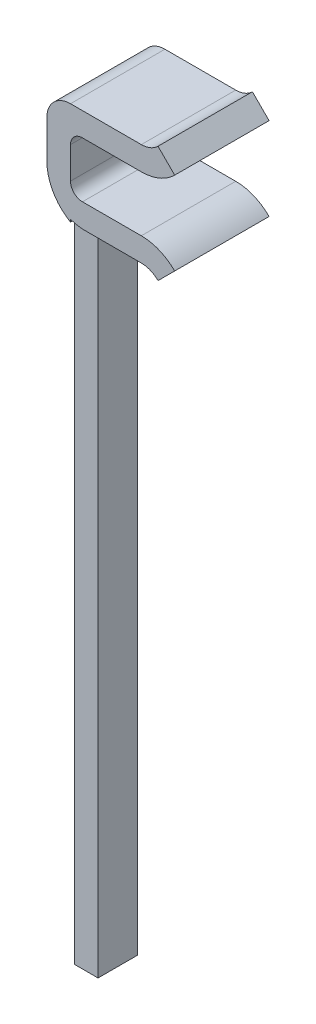
ISO-10303-21;
HEADER;
FILE_DESCRIPTION(('STEP AP214'),'2;1');
FILE_NAME('part.step','',(''),(''),'','','');
FILE_SCHEMA(('AUTOMOTIVE_DESIGN { 1 0 10303 214 1 1 1 1 }'));
ENDSEC;
DATA;
#1=APPLICATION_CONTEXT('core data for automotive mechanical design processes');
#2=APPLICATION_PROTOCOL_DEFINITION('international standard','automotive_design',2000,#1);
#3=PRODUCT_CONTEXT('',#1,'mechanical');
#4=PRODUCT('Part','Part','',(#3));
#5=PRODUCT_RELATED_PRODUCT_CATEGORY('part','',(#4));
#6=PRODUCT_DEFINITION_FORMATION('','',#4);
#7=PRODUCT_DEFINITION_CONTEXT('part definition',#1,'design');
#8=PRODUCT_DEFINITION('design','',#6,#7);
#9=PRODUCT_DEFINITION_SHAPE('','',#8);
#10=(LENGTH_UNIT() NAMED_UNIT(*) SI_UNIT(.MILLI.,.METRE.));
#11=(NAMED_UNIT(*) PLANE_ANGLE_UNIT() SI_UNIT($,.RADIAN.));
#12=(NAMED_UNIT(*) SI_UNIT($,.STERADIAN.) SOLID_ANGLE_UNIT());
#13=UNCERTAINTY_MEASURE_WITH_UNIT(LENGTH_MEASURE(1.E-05),#10,'distance_accuracy_value','');
#14=(GEOMETRIC_REPRESENTATION_CONTEXT(3) GLOBAL_UNCERTAINTY_ASSIGNED_CONTEXT((#13)) GLOBAL_UNIT_ASSIGNED_CONTEXT((#10,
#11,#12)) REPRESENTATION_CONTEXT('',''));
#15=CARTESIAN_POINT('',(0.,0.,0.));
#16=DIRECTION('',(0.,0.,1.));
#17=DIRECTION('',(1.,0.,0.));
#18=AXIS2_PLACEMENT_3D('',#15,#16,#17);
#19=CARTESIAN_POINT('',(0.,-5.646158466794,0.));
#20=DIRECTION('',(1.,0.,0.));
#21=DIRECTION('',(0.,0.,-1.));
#22=AXIS2_PLACEMENT_3D('',#19,#20,#21);
#23=PLANE('',#22);
#24=DIRECTION('',(0.,1.,0.));
#25=VECTOR('',#24,1.);
#26=CARTESIAN_POINT('',(0.,-5.646158466794,1.2));
#27=LINE('',#26,#25);
#28=CARTESIAN_POINT('',(-1.63145321904756E-13,-0.616158466794883,1.2));
#29=VERTEX_POINT('',#28);
#30=CARTESIAN_POINT('',(0.,-0.649999999999832,1.2));
#31=VERTEX_POINT('',#30);
#32=EDGE_CURVE('E306',#29,#31,#27,.F.);
#33=ORIENTED_EDGE('',*,*,#32,.T.);
#34=DIRECTION('',(0.,0.,-1.));
#35=VECTOR('',#34,1.);
#36=CARTESIAN_POINT('',(0.,-0.65,0.));
#37=LINE('',#36,#35);
#38=CARTESIAN_POINT('',(0.,-0.649999999999834,0.85));
#39=VERTEX_POINT('',#38);
#40=EDGE_CURVE('E300',#31,#39,#37,.T.);
#41=ORIENTED_EDGE('',*,*,#40,.T.);
#42=DIRECTION('',(0.,1.,0.));
#43=VECTOR('',#42,1.);
#44=CARTESIAN_POINT('',(0.,-0.65,0.85));
#45=LINE('',#44,#43);
#46=CARTESIAN_POINT('',(0.,-9.146158466794,0.85));
#47=VERTEX_POINT('',#46);
#48=EDGE_CURVE('E239',#39,#47,#45,.F.);
#49=ORIENTED_EDGE('',*,*,#48,.T.);
#50=DIRECTION('',(0.,0.,-1.));
#51=VECTOR('',#50,1.);
#52=CARTESIAN_POINT('',(0.,-9.146158466794,0.));
#53=LINE('',#52,#51);
#54=CARTESIAN_POINT('',(0.,-9.146158466794,0.35));
#55=VERTEX_POINT('',#54);
#56=EDGE_CURVE('E241',#55,#47,#53,.F.);
#57=ORIENTED_EDGE('',*,*,#56,.F.);
#58=DIRECTION('',(0.,1.,0.));
#59=VECTOR('',#58,1.);
#60=CARTESIAN_POINT('',(0.,-5.65,0.35));
#61=LINE('',#60,#59);
#62=CARTESIAN_POINT('',(0.,-0.649999999999832,0.35));
#63=VERTEX_POINT('',#62);
#64=EDGE_CURVE('E251',#55,#63,#61,.T.);
#65=ORIENTED_EDGE('',*,*,#64,.T.);
#66=DIRECTION('',(0.,0.,-1.));
#67=VECTOR('',#66,1.);
#68=CARTESIAN_POINT('',(0.,-0.65,0.));
#69=LINE('',#68,#67);
#70=CARTESIAN_POINT('',(0.,-0.649999999999832,0.));
#71=VERTEX_POINT('',#70);
#72=EDGE_CURVE('E172',#63,#71,#69,.T.);
#73=ORIENTED_EDGE('',*,*,#72,.T.);
#74=DIRECTION('',(0.,1.,0.));
#75=VECTOR('',#74,1.);
#76=CARTESIAN_POINT('',(0.,-5.646158466794,0.));
#77=LINE('',#76,#75);
#78=CARTESIAN_POINT('',(-1.63145321904756E-13,-0.616158466794883,0.));
#79=VERTEX_POINT('',#78);
#80=EDGE_CURVE('E308',#71,#79,#77,.T.);
#81=ORIENTED_EDGE('',*,*,#80,.T.);
#82=DIRECTION('',(0.,0.,1.));
#83=VECTOR('',#82,1.);
#84=CARTESIAN_POINT('',(-3.26290643809513E-13,-0.616158466794818,0.));
#85=LINE('',#84,#83);
#86=EDGE_CURVE('E297',#29,#79,#85,.F.);
#87=ORIENTED_EDGE('',*,*,#86,.F.);
#88=EDGE_LOOP('',(#33,#41,#49,#57,#65,#73,#81,#87));
#89=FACE_BOUND('',#88,.T.);
#90=ADVANCED_FACE('F17',(#89),#23,.T.);
#91=CARTESIAN_POINT('',(0.176336866195,-0.173663133806,0.));
#92=DIRECTION('',(0.,0.,1.));
#93=DIRECTION('',(1.,0.,0.));
#94=AXIS2_PLACEMENT_3D('',#91,#92,#93);
#95=CYLINDRICAL_SURFACE('',#94,0.476336866195);
#96=DIRECTION('',(0.,0.,-1.));
#97=VECTOR('',#96,1.);
#98=CARTESIAN_POINT('',(0.176336866195,-0.65,0.));
#99=LINE('',#98,#97);
#100=CARTESIAN_POINT('',(0.176336866195,-0.65,1.2));
#101=VERTEX_POINT('',#100);
#102=CARTESIAN_POINT('',(0.176336866195,-0.65,0.));
#103=VERTEX_POINT('',#102);
#104=EDGE_CURVE('E294',#101,#103,#99,.T.);
#105=ORIENTED_EDGE('',*,*,#104,.F.);
#106=CARTESIAN_POINT('',(0.176336866195,-0.173663133806,1.2));
#107=DIRECTION('',(0.,0.,1.));
#108=DIRECTION('',(1.,0.,0.));
#109=AXIS2_PLACEMENT_3D('',#106,#107,#108);
#110=CIRCLE('',#109,0.476336866195);
#111=EDGE_CURVE('E231',#29,#101,#110,.T.);
#112=ORIENTED_EDGE('',*,*,#111,.F.);
#113=ORIENTED_EDGE('',*,*,#86,.T.);
#114=CARTESIAN_POINT('',(0.176336866195,-0.173663133806,0.));
#115=DIRECTION('',(0.,0.,1.));
#116=DIRECTION('',(1.,0.,0.));
#117=AXIS2_PLACEMENT_3D('',#114,#115,#116);
#118=CIRCLE('',#117,0.476336866195);
#119=EDGE_CURVE('E334',#79,#103,#118,.T.);
#120=ORIENTED_EDGE('',*,*,#119,.T.);
#121=EDGE_LOOP('',(#105,#112,#113,#120));
#122=FACE_BOUND('',#121,.T.);
#123=ADVANCED_FACE('F365',(#122),#95,.T.);
#124=CARTESIAN_POINT('',(0.176336866195,-0.65,0.));
#125=DIRECTION('',(0.,-1.,0.));
#126=DIRECTION('',(0.,0.,-1.));
#127=AXIS2_PLACEMENT_3D('',#124,#125,#126);
#128=PLANE('',#127);
#129=DIRECTION('',(0.,0.,1.));
#130=VECTOR('',#129,1.);
#131=CARTESIAN_POINT('',(0.9,-0.65,0.));
#132=LINE('',#131,#130);
#133=CARTESIAN_POINT('',(0.9,-0.65,0.));
#134=VERTEX_POINT('',#133);
#135=CARTESIAN_POINT('',(0.9,-0.65,1.2));
#136=VERTEX_POINT('',#135);
#137=EDGE_CURVE('E292',#134,#136,#132,.T.);
#138=ORIENTED_EDGE('',*,*,#137,.T.);
#139=DIRECTION('',(1.,0.,0.));
#140=VECTOR('',#139,1.);
#141=CARTESIAN_POINT('',(0.,-0.65,1.2));
#142=LINE('',#141,#140);
#143=EDGE_CURVE('E228',#101,#136,#142,.T.);
#144=ORIENTED_EDGE('',*,*,#143,.F.);
#145=ORIENTED_EDGE('',*,*,#104,.T.);
#146=DIRECTION('',(1.,0.,0.));
#147=VECTOR('',#146,1.);
#148=CARTESIAN_POINT('',(0.,-0.65,0.));
#149=LINE('',#148,#147);
#150=EDGE_CURVE('E333',#103,#134,#149,.T.);
#151=ORIENTED_EDGE('',*,*,#150,.T.);
#152=EDGE_LOOP('',(#138,#144,#145,#151));
#153=FACE_BOUND('',#152,.T.);
#154=ADVANCED_FACE('F431',(#153),#128,.T.);
#155=CARTESIAN_POINT('',(0.9,-0.95,0.));
#156=DIRECTION('',(0.,0.,1.));
#157=DIRECTION('',(1.,0.,0.));
#158=AXIS2_PLACEMENT_3D('',#155,#156,#157);
#159=CYLINDRICAL_SURFACE('',#158,0.3);
#160=ORIENTED_EDGE('',*,*,#137,.F.);
#161=CARTESIAN_POINT('',(0.9,-0.95,0.));
#162=DIRECTION('',(0.,0.,1.));
#163=DIRECTION('',(1.,0.,0.));
#164=AXIS2_PLACEMENT_3D('',#161,#162,#163);
#165=CIRCLE('',#164,0.3);
#166=CARTESIAN_POINT('',(1.11213203435598,-0.737867965644018,0.));
#167=VERTEX_POINT('',#166);
#168=EDGE_CURVE('E331',#134,#167,#165,.F.);
#169=ORIENTED_EDGE('',*,*,#168,.T.);
#170=DIRECTION('',(0.,0.,1.));
#171=VECTOR('',#170,1.);
#172=CARTESIAN_POINT('',(1.112132034356,-0.737867965644,0.));
#173=LINE('',#172,#171);
#174=CARTESIAN_POINT('',(1.11213203435598,-0.737867965644018,1.2));
#175=VERTEX_POINT('',#174);
#176=EDGE_CURVE('E289',#175,#167,#173,.F.);
#177=ORIENTED_EDGE('',*,*,#176,.F.);
#178=CARTESIAN_POINT('',(0.9,-0.95,1.2));
#179=DIRECTION('',(0.,0.,1.));
#180=DIRECTION('',(1.,0.,0.));
#181=AXIS2_PLACEMENT_3D('',#178,#179,#180);
#182=CIRCLE('',#181,0.3);
#183=EDGE_CURVE('E227',#136,#175,#182,.F.);
#184=ORIENTED_EDGE('',*,*,#183,.F.);
#185=EDGE_LOOP('',(#160,#169,#177,#184));
#186=FACE_BOUND('',#185,.T.);
#187=ADVANCED_FACE('F429',(#186),#159,.F.);
#188=CARTESIAN_POINT('',(1.112132034356,-0.737867965644,0.));
#189=DIRECTION('',(0.707106781186548,-0.707106781186548,0.));
#190=DIRECTION('',(0.707106781186548,0.707106781186548,0.));
#191=AXIS2_PLACEMENT_3D('',#188,#189,#190);
#192=PLANE('',#191);
#193=DIRECTION('',(0.,0.,1.));
#194=VECTOR('',#193,1.);
#195=CARTESIAN_POINT('',(1.32426406871193,-0.525735931288072,0.));
#196=LINE('',#195,#194);
#197=CARTESIAN_POINT('',(1.32426406871193,-0.525735931288072,1.2));
#198=VERTEX_POINT('',#197);
#199=CARTESIAN_POINT('',(1.32426406871193,-0.525735931288072,0.));
#200=VERTEX_POINT('',#199);
#201=EDGE_CURVE('E286',#198,#200,#196,.F.);
#202=ORIENTED_EDGE('',*,*,#201,.F.);
#203=DIRECTION('',(0.707106781186548,0.707106781186547,0.));
#204=VECTOR('',#203,1.);
#205=CARTESIAN_POINT('',(1.112132034356,-0.737867965644,1.2));
#206=LINE('',#205,#204);
#207=EDGE_CURVE('E224',#175,#198,#206,.T.);
#208=ORIENTED_EDGE('',*,*,#207,.F.);
#209=ORIENTED_EDGE('',*,*,#176,.T.);
#210=DIRECTION('',(0.707106781186548,0.707106781186547,0.));
#211=VECTOR('',#210,1.);
#212=CARTESIAN_POINT('',(1.112132034356,-0.737867965644,0.));
#213=LINE('',#212,#211);
#214=EDGE_CURVE('E330',#167,#200,#213,.T.);
#215=ORIENTED_EDGE('',*,*,#214,.T.);
#216=EDGE_LOOP('',(#202,#208,#209,#215));
#217=FACE_BOUND('',#216,.T.);
#218=ADVANCED_FACE('F426',(#217),#192,.T.);
#219=CARTESIAN_POINT('',(0.9,-0.95,0.));
#220=DIRECTION('',(0.,0.,1.));
#221=DIRECTION('',(1.,0.,0.));
#222=AXIS2_PLACEMENT_3D('',#219,#220,#221);
#223=CYLINDRICAL_SURFACE('',#222,0.6);
#224=DIRECTION('',(0.,0.,1.));
#225=VECTOR('',#224,1.);
#226=CARTESIAN_POINT('',(0.9,-0.35,0.));
#227=LINE('',#226,#225);
#228=CARTESIAN_POINT('',(0.9,-0.35,1.2));
#229=VERTEX_POINT('',#228);
#230=CARTESIAN_POINT('',(0.9,-0.35,0.));
#231=VERTEX_POINT('',#230);
#232=EDGE_CURVE('E283',#229,#231,#227,.F.);
#233=ORIENTED_EDGE('',*,*,#232,.F.);
#234=CARTESIAN_POINT('',(0.9,-0.95,1.2));
#235=DIRECTION('',(0.,0.,1.));
#236=DIRECTION('',(1.,0.,0.));
#237=AXIS2_PLACEMENT_3D('',#234,#235,#236);
#238=CIRCLE('',#237,0.6);
#239=EDGE_CURVE('E223',#198,#229,#238,.T.);
#240=ORIENTED_EDGE('',*,*,#239,.F.);
#241=ORIENTED_EDGE('',*,*,#201,.T.);
#242=CARTESIAN_POINT('',(0.9,-0.95,0.));
#243=DIRECTION('',(0.,0.,1.));
#244=DIRECTION('',(1.,0.,0.));
#245=AXIS2_PLACEMENT_3D('',#242,#243,#244);
#246=CIRCLE('',#245,0.6);
#247=EDGE_CURVE('E328',#200,#231,#246,.T.);
#248=ORIENTED_EDGE('',*,*,#247,.T.);
#249=EDGE_LOOP('',(#233,#240,#241,#248));
#250=FACE_BOUND('',#249,.T.);
#251=ADVANCED_FACE('F423',(#250),#223,.T.);
#252=CARTESIAN_POINT('',(0.9,-0.35,0.));
#253=DIRECTION('',(0.,1.,0.));
#254=DIRECTION('',(0.,0.,1.));
#255=AXIS2_PLACEMENT_3D('',#252,#253,#254);
#256=PLANE('',#255);
#257=DIRECTION('',(0.,0.,1.));
#258=VECTOR('',#257,1.);
#259=CARTESIAN_POINT('',(0.151883838654,-0.35,0.));
#260=LINE('',#259,#258);
#261=CARTESIAN_POINT('',(0.151883838654,-0.35,0.));
#262=VERTEX_POINT('',#261);
#263=CARTESIAN_POINT('',(0.151883838654,-0.35,1.2));
#264=VERTEX_POINT('',#263);
#265=EDGE_CURVE('E281',#262,#264,#260,.T.);
#266=ORIENTED_EDGE('',*,*,#265,.T.);
#267=DIRECTION('',(1.,0.,0.));
#268=VECTOR('',#267,1.);
#269=CARTESIAN_POINT('',(0.,-0.35,1.2));
#270=LINE('',#269,#268);
#271=EDGE_CURVE('E220',#229,#264,#270,.F.);
#272=ORIENTED_EDGE('',*,*,#271,.F.);
#273=ORIENTED_EDGE('',*,*,#232,.T.);
#274=DIRECTION('',(1.,0.,0.));
#275=VECTOR('',#274,1.);
#276=CARTESIAN_POINT('',(0.,-0.35,0.));
#277=LINE('',#276,#275);
#278=EDGE_CURVE('E327',#231,#262,#277,.F.);
#279=ORIENTED_EDGE('',*,*,#278,.T.);
#280=EDGE_LOOP('',(#266,#272,#273,#279));
#281=FACE_BOUND('',#280,.T.);
#282=ADVANCED_FACE('F419',(#281),#256,.T.);
#283=CARTESIAN_POINT('',(0.151883838654,-0.198116161346,0.));
#284=DIRECTION('',(0.,0.,1.));
#285=DIRECTION('',(1.,0.,0.));
#286=AXIS2_PLACEMENT_3D('',#283,#284,#285);
#287=CYLINDRICAL_SURFACE('',#286,0.151883838654);
#288=ORIENTED_EDGE('',*,*,#265,.F.);
#289=CARTESIAN_POINT('',(0.151883838654,-0.198116161346,0.));
#290=DIRECTION('',(0.,0.,1.));
#291=DIRECTION('',(1.,0.,0.));
#292=AXIS2_PLACEMENT_3D('',#289,#290,#291);
#293=CIRCLE('',#292,0.151883838654);
#294=CARTESIAN_POINT('',(0.,-0.198116161346,0.));
#295=VERTEX_POINT('',#294);
#296=EDGE_CURVE('E325',#262,#295,#293,.F.);
#297=ORIENTED_EDGE('',*,*,#296,.T.);
#298=DIRECTION('',(0.,0.,-1.));
#299=VECTOR('',#298,1.);
#300=CARTESIAN_POINT('',(0.,-0.198116161346,0.));
#301=LINE('',#300,#299);
#302=CARTESIAN_POINT('',(0.,-0.198116161346,1.2));
#303=VERTEX_POINT('',#302);
#304=EDGE_CURVE('E278',#303,#295,#301,.T.);
#305=ORIENTED_EDGE('',*,*,#304,.F.);
#306=CARTESIAN_POINT('',(0.151883838654,-0.198116161346,1.2));
#307=DIRECTION('',(0.,0.,1.));
#308=DIRECTION('',(1.,0.,0.));
#309=AXIS2_PLACEMENT_3D('',#306,#307,#308);
#310=CIRCLE('',#309,0.151883838654);
#311=EDGE_CURVE('E219',#264,#303,#310,.F.);
#312=ORIENTED_EDGE('',*,*,#311,.F.);
#313=EDGE_LOOP('',(#288,#297,#305,#312));
#314=FACE_BOUND('',#313,.T.);
#315=ADVANCED_FACE('F415',(#314),#287,.F.);
#316=CARTESIAN_POINT('',(0.,-0.198116161346,0.));
#317=DIRECTION('',(1.,0.,0.));
#318=DIRECTION('',(0.,0.,-1.));
#319=AXIS2_PLACEMENT_3D('',#316,#317,#318);
#320=PLANE('',#319);
#321=DIRECTION('',(0.,0.,1.));
#322=VECTOR('',#321,1.);
#323=CARTESIAN_POINT('',(0.,0.203841533206,0.));
#324=LINE('',#323,#322);
#325=CARTESIAN_POINT('',(0.,0.203841533206,0.));
#326=VERTEX_POINT('',#325);
#327=CARTESIAN_POINT('',(0.,0.203841533206,1.2));
#328=VERTEX_POINT('',#327);
#329=EDGE_CURVE('E276',#326,#328,#324,.T.);
#330=ORIENTED_EDGE('',*,*,#329,.T.);
#331=DIRECTION('',(0.,1.,0.));
#332=VECTOR('',#331,1.);
#333=CARTESIAN_POINT('',(0.,0.,1.2));
#334=LINE('',#333,#332);
#335=EDGE_CURVE('E216',#303,#328,#334,.T.);
#336=ORIENTED_EDGE('',*,*,#335,.F.);
#337=ORIENTED_EDGE('',*,*,#304,.T.);
#338=DIRECTION('',(0.,1.,0.));
#339=VECTOR('',#338,1.);
#340=CARTESIAN_POINT('',(0.,0.,0.));
#341=LINE('',#340,#339);
#342=EDGE_CURVE('E324',#295,#326,#341,.T.);
#343=ORIENTED_EDGE('',*,*,#342,.T.);
#344=EDGE_LOOP('',(#330,#336,#337,#343));
#345=FACE_BOUND('',#344,.T.);
#346=ADVANCED_FACE('F411',(#345),#320,.T.);
#347=CARTESIAN_POINT('',(0.15,0.203841533206,0.));
#348=DIRECTION('',(0.,0.,1.));
#349=DIRECTION('',(1.,0.,0.));
#350=AXIS2_PLACEMENT_3D('',#347,#348,#349);
#351=CYLINDRICAL_SURFACE('',#350,0.15);
#352=ORIENTED_EDGE('',*,*,#329,.F.);
#353=CARTESIAN_POINT('',(0.15,0.203841533206,0.));
#354=DIRECTION('',(0.,0.,1.));
#355=DIRECTION('',(1.,0.,0.));
#356=AXIS2_PLACEMENT_3D('',#353,#354,#355);
#357=CIRCLE('',#356,0.15);
#358=CARTESIAN_POINT('',(0.15,0.353841533206,0.));
#359=VERTEX_POINT('',#358);
#360=EDGE_CURVE('E322',#326,#359,#357,.F.);
#361=ORIENTED_EDGE('',*,*,#360,.T.);
#362=DIRECTION('',(0.,0.,-1.));
#363=VECTOR('',#362,1.);
#364=CARTESIAN_POINT('',(0.15,0.353841533206,0.));
#365=LINE('',#364,#363);
#366=CARTESIAN_POINT('',(0.15,0.353841533206,1.2));
#367=VERTEX_POINT('',#366);
#368=EDGE_CURVE('E273',#367,#359,#365,.T.);
#369=ORIENTED_EDGE('',*,*,#368,.F.);
#370=CARTESIAN_POINT('',(0.15,0.203841533206,1.2));
#371=DIRECTION('',(0.,0.,1.));
#372=DIRECTION('',(1.,0.,0.));
#373=AXIS2_PLACEMENT_3D('',#370,#371,#372);
#374=CIRCLE('',#373,0.15);
#375=EDGE_CURVE('E215',#328,#367,#374,.F.);
#376=ORIENTED_EDGE('',*,*,#375,.F.);
#377=EDGE_LOOP('',(#352,#361,#369,#376));
#378=FACE_BOUND('',#377,.T.);
#379=ADVANCED_FACE('F407',(#378),#351,.F.);
#380=CARTESIAN_POINT('',(0.15,0.353841533206,0.));
#381=DIRECTION('',(0.,-1.,0.));
#382=DIRECTION('',(0.,0.,-1.));
#383=AXIS2_PLACEMENT_3D('',#380,#381,#382);
#384=PLANE('',#383);
#385=DIRECTION('',(0.,0.,1.));
#386=VECTOR('',#385,1.);
#387=CARTESIAN_POINT('',(0.9,0.353841533206,0.));
#388=LINE('',#387,#386);
#389=CARTESIAN_POINT('',(0.9,0.353841533206,1.2));
#390=VERTEX_POINT('',#389);
#391=CARTESIAN_POINT('',(0.9,0.353841533206,0.));
#392=VERTEX_POINT('',#391);
#393=EDGE_CURVE('E270',#390,#392,#388,.F.);
#394=ORIENTED_EDGE('',*,*,#393,.F.);
#395=DIRECTION('',(1.,0.,0.));
#396=VECTOR('',#395,1.);
#397=CARTESIAN_POINT('',(0.,0.353841533206,1.2));
#398=LINE('',#397,#396);
#399=EDGE_CURVE('E212',#367,#390,#398,.T.);
#400=ORIENTED_EDGE('',*,*,#399,.F.);
#401=ORIENTED_EDGE('',*,*,#368,.T.);
#402=DIRECTION('',(1.,0.,0.));
#403=VECTOR('',#402,1.);
#404=CARTESIAN_POINT('',(0.,0.353841533206,0.));
#405=LINE('',#404,#403);
#406=EDGE_CURVE('E321',#359,#392,#405,.T.);
#407=ORIENTED_EDGE('',*,*,#406,.T.);
#408=EDGE_LOOP('',(#394,#400,#401,#407));
#409=FACE_BOUND('',#408,.T.);
#410=ADVANCED_FACE('F401',(#409),#384,.T.);
#411=CARTESIAN_POINT('',(0.9,0.953841533206,0.));
#412=DIRECTION('',(0.,0.,1.));
#413=DIRECTION('',(1.,0.,0.));
#414=AXIS2_PLACEMENT_3D('',#411,#412,#413);
#415=CYLINDRICAL_SURFACE('',#414,0.6);
#416=DIRECTION('',(0.,0.,1.));
#417=VECTOR('',#416,1.);
#418=CARTESIAN_POINT('',(1.324264068712,0.529577464494,0.));
#419=LINE('',#418,#417);
#420=CARTESIAN_POINT('',(1.32426406871196,0.529577464494036,1.2));
#421=VERTEX_POINT('',#420);
#422=CARTESIAN_POINT('',(1.32426406871196,0.529577464494036,0.));
#423=VERTEX_POINT('',#422);
#424=EDGE_CURVE('E267',#421,#423,#419,.F.);
#425=ORIENTED_EDGE('',*,*,#424,.F.);
#426=CARTESIAN_POINT('',(0.9,0.953841533206,1.2));
#427=DIRECTION('',(0.,0.,1.));
#428=DIRECTION('',(1.,0.,0.));
#429=AXIS2_PLACEMENT_3D('',#426,#427,#428);
#430=CIRCLE('',#429,0.6);
#431=EDGE_CURVE('E211',#390,#421,#430,.T.);
#432=ORIENTED_EDGE('',*,*,#431,.F.);
#433=ORIENTED_EDGE('',*,*,#393,.T.);
#434=CARTESIAN_POINT('',(0.9,0.953841533206,0.));
#435=DIRECTION('',(0.,0.,1.));
#436=DIRECTION('',(1.,0.,0.));
#437=AXIS2_PLACEMENT_3D('',#434,#435,#436);
#438=CIRCLE('',#437,0.6);
#439=EDGE_CURVE('E319',#392,#423,#438,.T.);
#440=ORIENTED_EDGE('',*,*,#439,.T.);
#441=EDGE_LOOP('',(#425,#432,#433,#440));
#442=FACE_BOUND('',#441,.T.);
#443=ADVANCED_FACE('F398',(#442),#415,.T.);
#444=CARTESIAN_POINT('',(1.324264068712,0.529577464494,0.));
#445=DIRECTION('',(0.707106781186548,0.707106781186548,0.));
#446=DIRECTION('',(-0.707106781186548,0.707106781186548,0.));
#447=AXIS2_PLACEMENT_3D('',#444,#445,#446);
#448=PLANE('',#447);
#449=DIRECTION('',(0.,0.,1.));
#450=VECTOR('',#449,1.);
#451=CARTESIAN_POINT('',(1.11213203435596,0.741709498850036,0.));
#452=LINE('',#451,#450);
#453=CARTESIAN_POINT('',(1.11213203435596,0.741709498850036,0.));
#454=VERTEX_POINT('',#453);
#455=CARTESIAN_POINT('',(1.11213203435596,0.741709498850036,1.2));
#456=VERTEX_POINT('',#455);
#457=EDGE_CURVE('E265',#454,#456,#452,.T.);
#458=ORIENTED_EDGE('',*,*,#457,.T.);
#459=DIRECTION('',(-0.707106781186548,0.707106781186547,0.));
#460=VECTOR('',#459,1.);
#461=CARTESIAN_POINT('',(1.324264068712,0.529577464494,1.2));
#462=LINE('',#461,#460);
#463=EDGE_CURVE('E208',#421,#456,#462,.T.);
#464=ORIENTED_EDGE('',*,*,#463,.F.);
#465=ORIENTED_EDGE('',*,*,#424,.T.);
#466=DIRECTION('',(-0.707106781186548,0.707106781186547,0.));
#467=VECTOR('',#466,1.);
#468=CARTESIAN_POINT('',(1.324264068712,0.529577464494,0.));
#469=LINE('',#468,#467);
#470=EDGE_CURVE('E318',#423,#454,#469,.T.);
#471=ORIENTED_EDGE('',*,*,#470,.T.);
#472=EDGE_LOOP('',(#458,#464,#465,#471));
#473=FACE_BOUND('',#472,.T.);
#474=ADVANCED_FACE('F395',(#473),#448,.T.);
#475=CARTESIAN_POINT('',(0.9,0.953841533206,0.));
#476=DIRECTION('',(0.,0.,1.));
#477=DIRECTION('',(1.,0.,0.));
#478=AXIS2_PLACEMENT_3D('',#475,#476,#477);
#479=CYLINDRICAL_SURFACE('',#478,0.3);
#480=ORIENTED_EDGE('',*,*,#457,.F.);
#481=CARTESIAN_POINT('',(0.9,0.953841533206,0.));
#482=DIRECTION('',(0.,0.,1.));
#483=DIRECTION('',(1.,0.,0.));
#484=AXIS2_PLACEMENT_3D('',#481,#482,#483);
#485=CIRCLE('',#484,0.3);
#486=CARTESIAN_POINT('',(0.9,0.653841533206,0.));
#487=VERTEX_POINT('',#486);
#488=EDGE_CURVE('E316',#454,#487,#485,.F.);
#489=ORIENTED_EDGE('',*,*,#488,.T.);
#490=DIRECTION('',(0.,0.,1.));
#491=VECTOR('',#490,1.);
#492=CARTESIAN_POINT('',(0.9,0.653841533206,0.));
#493=LINE('',#492,#491);
#494=CARTESIAN_POINT('',(0.9,0.653841533206,1.2));
#495=VERTEX_POINT('',#494);
#496=EDGE_CURVE('E257',#495,#487,#493,.F.);
#497=ORIENTED_EDGE('',*,*,#496,.F.);
#498=CARTESIAN_POINT('',(0.9,0.953841533206,1.2));
#499=DIRECTION('',(0.,0.,1.));
#500=DIRECTION('',(1.,0.,0.));
#501=AXIS2_PLACEMENT_3D('',#498,#499,#500);
#502=CIRCLE('',#501,0.3);
#503=EDGE_CURVE('E207',#456,#495,#502,.F.);
#504=ORIENTED_EDGE('',*,*,#503,.F.);
#505=EDGE_LOOP('',(#480,#489,#497,#504));
#506=FACE_BOUND('',#505,.T.);
#507=ADVANCED_FACE('F390',(#506),#479,.F.);
#508=CARTESIAN_POINT('',(0.9,0.653841533206,0.));
#509=DIRECTION('',(0.,1.,0.));
#510=DIRECTION('',(0.,0.,1.));
#511=AXIS2_PLACEMENT_3D('',#508,#509,#510);
#512=PLANE('',#511);
#513=DIRECTION('',(0.,0.,1.));
#514=VECTOR('',#513,1.);
#515=CARTESIAN_POINT('',(0.,0.653841533206,0.));
#516=LINE('',#515,#514);
#517=CARTESIAN_POINT('',(0.,0.653841533206,1.2));
#518=VERTEX_POINT('',#517);
#519=CARTESIAN_POINT('',(0.,0.653841533206,0.));
#520=VERTEX_POINT('',#519);
#521=EDGE_CURVE('E206',#518,#520,#516,.F.);
#522=ORIENTED_EDGE('',*,*,#521,.F.);
#523=DIRECTION('',(1.,0.,0.));
#524=VECTOR('',#523,1.);
#525=CARTESIAN_POINT('',(0.,0.653841533206,1.2));
#526=LINE('',#525,#524);
#527=EDGE_CURVE('E203',#495,#518,#526,.F.);
#528=ORIENTED_EDGE('',*,*,#527,.F.);
#529=ORIENTED_EDGE('',*,*,#496,.T.);
#530=DIRECTION('',(1.,0.,0.));
#531=VECTOR('',#530,1.);
#532=CARTESIAN_POINT('',(0.,0.653841533206,0.));
#533=LINE('',#532,#531);
#534=EDGE_CURVE('E315',#487,#520,#533,.F.);
#535=ORIENTED_EDGE('',*,*,#534,.T.);
#536=EDGE_LOOP('',(#522,#528,#529,#535));
#537=FACE_BOUND('',#536,.T.);
#538=ADVANCED_FACE('F380',(#537),#512,.T.);
#539=CARTESIAN_POINT('',(-0.3,-5.65,0.35));
#540=DIRECTION('',(0.,0.,1.));
#541=DIRECTION('',(1.,0.,0.));
#542=AXIS2_PLACEMENT_3D('',#539,#540,#541);
#543=PLANE('',#542);
#544=DIRECTION('',(1.,0.,0.));
#545=VECTOR('',#544,1.);
#546=CARTESIAN_POINT('',(0.,-9.146158466794,0.35));
#547=LINE('',#546,#545);
#548=CARTESIAN_POINT('',(-0.3,-9.146158466794,0.35));
#549=VERTEX_POINT('',#548);
#550=EDGE_CURVE('E182',#549,#55,#547,.T.);
#551=ORIENTED_EDGE('',*,*,#550,.F.);
#552=DIRECTION('',(0.,1.,0.));
#553=VECTOR('',#552,1.);
#554=CARTESIAN_POINT('',(-0.3,0.353841533206,0.35));
#555=LINE('',#554,#553);
#556=CARTESIAN_POINT('',(-0.3,-0.130384757729,0.35));
#557=VERTEX_POINT('',#556);
#558=EDGE_CURVE('E178',#557,#549,#555,.F.);
#559=ORIENTED_EDGE('',*,*,#558,.F.);
#560=CARTESIAN_POINT('',(0.3,-0.130384757729,0.35));
#561=DIRECTION('',(0.,0.,1.));
#562=DIRECTION('',(1.,0.,0.));
#563=AXIS2_PLACEMENT_3D('',#560,#561,#562);
#564=CIRCLE('',#563,0.6);
#565=EDGE_CURVE('E180',#63,#557,#564,.F.);
#566=ORIENTED_EDGE('',*,*,#565,.F.);
#567=ORIENTED_EDGE('',*,*,#64,.F.);
#568=EDGE_LOOP('',(#551,#559,#566,#567));
#569=FACE_BOUND('',#568,.T.);
#570=ADVANCED_FACE('F179',(#569),#543,.F.);
#571=CARTESIAN_POINT('',(0.,-9.146158466794,0.));
#572=DIRECTION('',(0.,-1.,0.));
#573=DIRECTION('',(0.,0.,-1.));
#574=AXIS2_PLACEMENT_3D('',#571,#572,#573);
#575=PLANE('',#574);
#576=ORIENTED_EDGE('',*,*,#56,.T.);
#577=DIRECTION('',(-1.,0.,0.));
#578=VECTOR('',#577,1.);
#579=CARTESIAN_POINT('',(-0.3,-9.146158466794,0.85));
#580=LINE('',#579,#578);
#581=CARTESIAN_POINT('',(-0.3,-9.146158466794,0.85));
#582=VERTEX_POINT('',#581);
#583=EDGE_CURVE('E160',#47,#582,#580,.T.);
#584=ORIENTED_EDGE('',*,*,#583,.T.);
#585=DIRECTION('',(0.,0.,1.));
#586=VECTOR('',#585,1.);
#587=CARTESIAN_POINT('',(-0.3,-9.146158466794,0.));
#588=LINE('',#587,#586);
#589=EDGE_CURVE('E185',#549,#582,#588,.T.);
#590=ORIENTED_EDGE('',*,*,#589,.F.);
#591=ORIENTED_EDGE('',*,*,#550,.T.);
#592=EDGE_LOOP('',(#576,#584,#590,#591));
#593=FACE_BOUND('',#592,.T.);
#594=ADVANCED_FACE('F361',(#593),#575,.T.);
#595=CARTESIAN_POINT('',(-0.3,-0.65,0.85));
#596=DIRECTION('',(0.,0.,-1.));
#597=DIRECTION('',(-1.,0.,0.));
#598=AXIS2_PLACEMENT_3D('',#595,#596,#597);
#599=PLANE('',#598);
#600=ORIENTED_EDGE('',*,*,#583,.F.);
#601=ORIENTED_EDGE('',*,*,#48,.F.);
#602=CARTESIAN_POINT('',(0.3,-0.130384757729,0.85));
#603=DIRECTION('',(0.,0.,1.));
#604=DIRECTION('',(1.,0.,0.));
#605=AXIS2_PLACEMENT_3D('',#602,#603,#604);
#606=CIRCLE('',#605,0.6);
#607=CARTESIAN_POINT('',(-0.3,-0.130384757729,0.85));
#608=VERTEX_POINT('',#607);
#609=EDGE_CURVE('E20',#608,#39,#606,.T.);
#610=ORIENTED_EDGE('',*,*,#609,.F.);
#611=DIRECTION('',(0.,1.,0.));
#612=VECTOR('',#611,1.);
#613=CARTESIAN_POINT('',(-0.3,0.353841533206,0.85));
#614=LINE('',#613,#612);
#615=EDGE_CURVE('E234',#582,#608,#614,.T.);
#616=ORIENTED_EDGE('',*,*,#615,.F.);
#617=EDGE_LOOP('',(#600,#601,#610,#616));
#618=FACE_BOUND('',#617,.T.);
#619=ADVANCED_FACE('F360',(#618),#599,.F.);
#620=CARTESIAN_POINT('',(0.3,-0.130384757729,-0.01144899223456));
#621=DIRECTION('',(0.,0.,1.));
#622=DIRECTION('',(1.,0.,0.));
#623=AXIS2_PLACEMENT_3D('',#620,#621,#622);
#624=CYLINDRICAL_SURFACE('',#623,0.6);
#625=DIRECTION('',(0.,0.,1.));
#626=VECTOR('',#625,1.);
#627=CARTESIAN_POINT('',(-0.3,-0.130384757729,0.));
#628=LINE('',#627,#626);
#629=CARTESIAN_POINT('',(-0.3,-0.130384757729,1.2));
#630=VERTEX_POINT('',#629);
#631=EDGE_CURVE('E202',#608,#630,#628,.T.);
#632=ORIENTED_EDGE('',*,*,#631,.F.);
#633=ORIENTED_EDGE('',*,*,#609,.T.);
#634=ORIENTED_EDGE('',*,*,#40,.F.);
#635=CARTESIAN_POINT('',(0.3,-0.130384757729,1.2));
#636=DIRECTION('',(0.,0.,1.));
#637=DIRECTION('',(1.,0.,0.));
#638=AXIS2_PLACEMENT_3D('',#635,#636,#637);
#639=CIRCLE('',#638,0.6);
#640=EDGE_CURVE('E351',#630,#31,#639,.T.);
#641=ORIENTED_EDGE('',*,*,#640,.F.);
#642=EDGE_LOOP('',(#632,#633,#634,#641));
#643=FACE_BOUND('',#642,.T.);
#644=ADVANCED_FACE('F356',(#643),#624,.T.);
#645=CARTESIAN_POINT('',(0.,0.,1.2));
#646=DIRECTION('',(0.,0.,1.));
#647=DIRECTION('',(1.,0.,0.));
#648=AXIS2_PLACEMENT_3D('',#645,#646,#647);
#649=PLANE('',#648);
#650=ORIENTED_EDGE('',*,*,#527,.T.);
#651=CARTESIAN_POINT('',(0.,0.353841533206,1.2));
#652=DIRECTION('',(0.,0.,1.));
#653=DIRECTION('',(1.,0.,0.));
#654=AXIS2_PLACEMENT_3D('',#651,#652,#653);
#655=CIRCLE('',#654,0.3);
#656=CARTESIAN_POINT('',(-0.3,0.353841533206,1.2));
#657=VERTEX_POINT('',#656);
#658=EDGE_CURVE('E262',#657,#518,#655,.F.);
#659=ORIENTED_EDGE('',*,*,#658,.F.);
#660=DIRECTION('',(0.,1.,0.));
#661=VECTOR('',#660,1.);
#662=CARTESIAN_POINT('',(-0.3,0.353841533206,1.2));
#663=LINE('',#662,#661);
#664=EDGE_CURVE('E197',#630,#657,#663,.T.);
#665=ORIENTED_EDGE('',*,*,#664,.F.);
#666=ORIENTED_EDGE('',*,*,#640,.T.);
#667=ORIENTED_EDGE('',*,*,#32,.F.);
#668=ORIENTED_EDGE('',*,*,#111,.T.);
#669=ORIENTED_EDGE('',*,*,#143,.T.);
#670=ORIENTED_EDGE('',*,*,#183,.T.);
#671=ORIENTED_EDGE('',*,*,#207,.T.);
#672=ORIENTED_EDGE('',*,*,#239,.T.);
#673=ORIENTED_EDGE('',*,*,#271,.T.);
#674=ORIENTED_EDGE('',*,*,#311,.T.);
#675=ORIENTED_EDGE('',*,*,#335,.T.);
#676=ORIENTED_EDGE('',*,*,#375,.T.);
#677=ORIENTED_EDGE('',*,*,#399,.T.);
#678=ORIENTED_EDGE('',*,*,#431,.T.);
#679=ORIENTED_EDGE('',*,*,#463,.T.);
#680=ORIENTED_EDGE('',*,*,#503,.T.);
#681=EDGE_LOOP('',(#650,#659,#665,#666,#667,#668,#669,#670,#671,#672,#673,#674,#675,#676,#677,
#678,#679,#680));
#682=FACE_BOUND('',#681,.T.);
#683=ADVANCED_FACE('F385',(#682),#649,.T.);
#684=CARTESIAN_POINT('',(0.,0.353841533206,0.));
#685=DIRECTION('',(0.,0.,1.));
#686=DIRECTION('',(1.,0.,0.));
#687=AXIS2_PLACEMENT_3D('',#684,#685,#686);
#688=CYLINDRICAL_SURFACE('',#687,0.3);
#689=DIRECTION('',(0.,0.,1.));
#690=VECTOR('',#689,1.);
#691=CARTESIAN_POINT('',(-0.3,0.353841533206,0.));
#692=LINE('',#691,#690);
#693=CARTESIAN_POINT('',(-0.3,0.353841533206,0.));
#694=VERTEX_POINT('',#693);
#695=EDGE_CURVE('E194',#657,#694,#692,.F.);
#696=ORIENTED_EDGE('',*,*,#695,.F.);
#697=ORIENTED_EDGE('',*,*,#658,.T.);
#698=ORIENTED_EDGE('',*,*,#521,.T.);
#699=CARTESIAN_POINT('',(0.,0.353841533206,0.));
#700=DIRECTION('',(0.,0.,1.));
#701=DIRECTION('',(1.,0.,0.));
#702=AXIS2_PLACEMENT_3D('',#699,#700,#701);
#703=CIRCLE('',#702,0.3);
#704=EDGE_CURVE('E313',#520,#694,#703,.T.);
#705=ORIENTED_EDGE('',*,*,#704,.T.);
#706=EDGE_LOOP('',(#696,#697,#698,#705));
#707=FACE_BOUND('',#706,.T.);
#708=ADVANCED_FACE('F384',(#707),#688,.T.);
#709=CARTESIAN_POINT('',(0.,0.,0.));
#710=DIRECTION('',(0.,0.,1.));
#711=DIRECTION('',(1.,0.,0.));
#712=AXIS2_PLACEMENT_3D('',#709,#710,#711);
#713=PLANE('',#712);
#714=ORIENTED_EDGE('',*,*,#534,.F.);
#715=ORIENTED_EDGE('',*,*,#488,.F.);
#716=ORIENTED_EDGE('',*,*,#470,.F.);
#717=ORIENTED_EDGE('',*,*,#439,.F.);
#718=ORIENTED_EDGE('',*,*,#406,.F.);
#719=ORIENTED_EDGE('',*,*,#360,.F.);
#720=ORIENTED_EDGE('',*,*,#342,.F.);
#721=ORIENTED_EDGE('',*,*,#296,.F.);
#722=ORIENTED_EDGE('',*,*,#278,.F.);
#723=ORIENTED_EDGE('',*,*,#247,.F.);
#724=ORIENTED_EDGE('',*,*,#214,.F.);
#725=ORIENTED_EDGE('',*,*,#168,.F.);
#726=ORIENTED_EDGE('',*,*,#150,.F.);
#727=ORIENTED_EDGE('',*,*,#119,.F.);
#728=ORIENTED_EDGE('',*,*,#80,.F.);
#729=CARTESIAN_POINT('',(0.3,-0.130384757729,0.));
#730=DIRECTION('',(0.,0.,1.));
#731=DIRECTION('',(1.,0.,0.));
#732=AXIS2_PLACEMENT_3D('',#729,#730,#731);
#733=CIRCLE('',#732,0.6);
#734=CARTESIAN_POINT('',(-0.3,-0.130384757729,0.));
#735=VERTEX_POINT('',#734);
#736=EDGE_CURVE('E35',#735,#71,#733,.T.);
#737=ORIENTED_EDGE('',*,*,#736,.F.);
#738=DIRECTION('',(0.,1.,0.));
#739=VECTOR('',#738,1.);
#740=CARTESIAN_POINT('',(-0.3,0.353841533206,0.));
#741=LINE('',#740,#739);
#742=EDGE_CURVE('E26',#694,#735,#741,.F.);
#743=ORIENTED_EDGE('',*,*,#742,.F.);
#744=ORIENTED_EDGE('',*,*,#704,.F.);
#745=EDGE_LOOP('',(#714,#715,#716,#717,#718,#719,#720,#721,#722,#723,#724,#725,#726,#727,#728,
#737,#743,#744));
#746=FACE_BOUND('',#745,.T.);
#747=ADVANCED_FACE('F368',(#746),#713,.F.);
#748=CARTESIAN_POINT('',(0.3,-0.130384757729,-0.01144899223456));
#749=DIRECTION('',(0.,0.,1.));
#750=DIRECTION('',(1.,0.,0.));
#751=AXIS2_PLACEMENT_3D('',#748,#749,#750);
#752=CYLINDRICAL_SURFACE('',#751,0.6);
#753=ORIENTED_EDGE('',*,*,#565,.T.);
#754=DIRECTION('',(0.,0.,1.));
#755=VECTOR('',#754,1.);
#756=CARTESIAN_POINT('',(-0.3,-0.130384757729,0.));
#757=LINE('',#756,#755);
#758=EDGE_CURVE('E11',#735,#557,#757,.T.);
#759=ORIENTED_EDGE('',*,*,#758,.F.);
#760=ORIENTED_EDGE('',*,*,#736,.T.);
#761=ORIENTED_EDGE('',*,*,#72,.F.);
#762=EDGE_LOOP('',(#753,#759,#760,#761));
#763=FACE_BOUND('',#762,.T.);
#764=ADVANCED_FACE('F187',(#763),#752,.T.);
#765=CARTESIAN_POINT('',(-0.3,0.353841533206,0.));
#766=DIRECTION('',(-1.,0.,0.));
#767=DIRECTION('',(0.,0.,1.));
#768=AXIS2_PLACEMENT_3D('',#765,#766,#767);
#769=PLANE('',#768);
#770=ORIENTED_EDGE('',*,*,#742,.T.);
#771=ORIENTED_EDGE('',*,*,#758,.T.);
#772=ORIENTED_EDGE('',*,*,#558,.T.);
#773=ORIENTED_EDGE('',*,*,#589,.T.);
#774=ORIENTED_EDGE('',*,*,#615,.T.);
#775=ORIENTED_EDGE('',*,*,#631,.T.);
#776=ORIENTED_EDGE('',*,*,#664,.T.);
#777=ORIENTED_EDGE('',*,*,#695,.T.);
#778=EDGE_LOOP('',(#770,#771,#772,#773,#774,#775,#776,#777));
#779=FACE_BOUND('',#778,.T.);
#780=ADVANCED_FACE('F190',(#779),#769,.T.);
#781=CLOSED_SHELL('',(#90,#123,#154,#187,#218,#251,#282,#315,#346,#379,#410,#443,#474,#507,#538,
#570,#594,#619,#644,#683,#708,#747,#764,#780));
#782=MANIFOLD_SOLID_BREP('B1',#781);
#783=ADVANCED_BREP_SHAPE_REPRESENTATION('',(#18,#782),#14);
#784=SHAPE_DEFINITION_REPRESENTATION(#9,#783);
ENDSEC;
END-ISO-10303-21;
